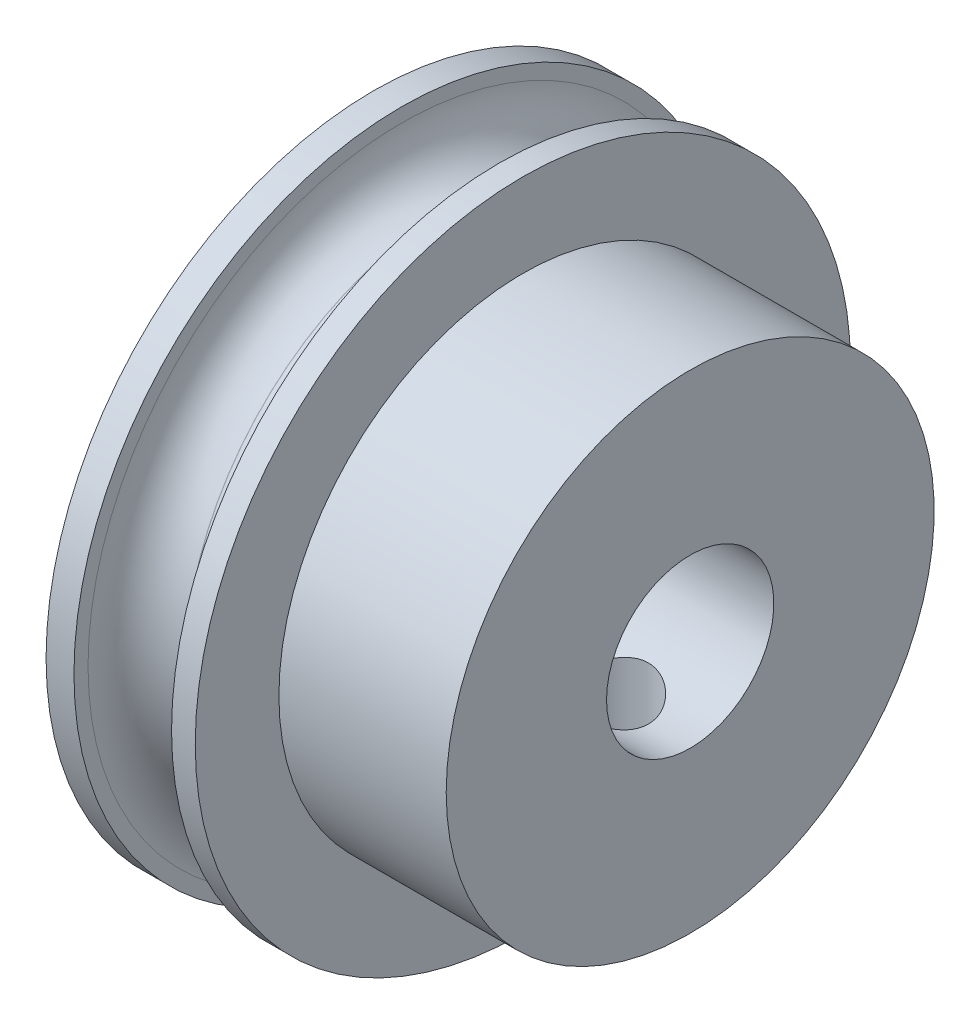
ISO-10303-21;
HEADER;
FILE_DESCRIPTION(('STEP AP214'),'2;1');
FILE_NAME('part.step','',(''),(''),'','','');
FILE_SCHEMA(('AUTOMOTIVE_DESIGN { 1 0 10303 214 1 1 1 1 }'));
ENDSEC;
DATA;
#1=APPLICATION_CONTEXT('core data for automotive mechanical design processes');
#2=APPLICATION_PROTOCOL_DEFINITION('international standard','automotive_design',2000,#1);
#3=PRODUCT_CONTEXT('',#1,'mechanical');
#4=PRODUCT('Part','Part','',(#3));
#5=PRODUCT_RELATED_PRODUCT_CATEGORY('part','',(#4));
#6=PRODUCT_DEFINITION_FORMATION('','',#4);
#7=PRODUCT_DEFINITION_CONTEXT('part definition',#1,'design');
#8=PRODUCT_DEFINITION('design','',#6,#7);
#9=PRODUCT_DEFINITION_SHAPE('','',#8);
#10=(LENGTH_UNIT() NAMED_UNIT(*) SI_UNIT(.MILLI.,.METRE.));
#11=(NAMED_UNIT(*) PLANE_ANGLE_UNIT() SI_UNIT($,.RADIAN.));
#12=(NAMED_UNIT(*) SI_UNIT($,.STERADIAN.) SOLID_ANGLE_UNIT());
#13=UNCERTAINTY_MEASURE_WITH_UNIT(LENGTH_MEASURE(1.E-05),#10,'distance_accuracy_value','');
#14=(GEOMETRIC_REPRESENTATION_CONTEXT(3) GLOBAL_UNCERTAINTY_ASSIGNED_CONTEXT((#13)) GLOBAL_UNIT_ASSIGNED_CONTEXT((#10,
#11,#12)) REPRESENTATION_CONTEXT('',''));
#15=CARTESIAN_POINT('',(0.,0.,0.));
#16=DIRECTION('',(0.,0.,1.));
#17=DIRECTION('',(1.,0.,0.));
#18=AXIS2_PLACEMENT_3D('',#15,#16,#17);
#19=CARTESIAN_POINT('',(0.,23.5,0.));
#20=DIRECTION('',(1.,0.,0.));
#21=DIRECTION('',(0.,0.,-1.));
#22=AXIS2_PLACEMENT_3D('',#19,#20,#21);
#23=PLANE('',#22);
#24=CARTESIAN_POINT('',(0.,0.,0.));
#25=DIRECTION('',(-1.,0.,0.));
#26=DIRECTION('',(0.,0.,1.));
#27=AXIS2_PLACEMENT_3D('',#24,#25,#26);
#28=CIRCLE('',#27,6.);
#29=CARTESIAN_POINT('',(0.,0.,6.00000000000001));
#30=VERTEX_POINT('',#29);
#31=EDGE_CURVE('E86',#30,#30,#28,.T.);
#32=ORIENTED_EDGE('',*,*,#31,.F.);
#33=EDGE_LOOP('',(#32));
#34=FACE_BOUND('',#33,.T.);
#35=CARTESIAN_POINT('',(0.,0.,0.));
#36=DIRECTION('',(-1.,0.,0.));
#37=DIRECTION('',(0.,0.,1.));
#38=AXIS2_PLACEMENT_3D('',#35,#36,#37);
#39=CIRCLE('',#38,23.5);
#40=CARTESIAN_POINT('',(0.,0.,23.5));
#41=VERTEX_POINT('',#40);
#42=EDGE_CURVE('E12',#41,#41,#39,.T.);
#43=ORIENTED_EDGE('',*,*,#42,.T.);
#44=EDGE_LOOP('',(#43));
#45=FACE_BOUND('',#44,.T.);
#46=ADVANCED_FACE('F46',(#34,#45),#23,.F.);
#47=CARTESIAN_POINT('',(0.,0.,0.));
#48=DIRECTION('',(-1.,0.,0.));
#49=DIRECTION('',(0.,0.,1.));
#50=AXIS2_PLACEMENT_3D('',#47,#48,#49);
#51=CYLINDRICAL_SURFACE('',#50,23.5);
#52=ORIENTED_EDGE('',*,*,#42,.F.);
#53=EDGE_LOOP('',(#52));
#54=FACE_BOUND('',#53,.T.);
#55=CARTESIAN_POINT('',(2.,0.,0.));
#56=DIRECTION('',(-1.,0.,0.));
#57=DIRECTION('',(0.,0.,1.));
#58=AXIS2_PLACEMENT_3D('',#55,#56,#57);
#59=CIRCLE('',#58,23.5);
#60=CARTESIAN_POINT('',(2.,0.,23.5));
#61=VERTEX_POINT('',#60);
#62=EDGE_CURVE('E52',#61,#61,#59,.T.);
#63=ORIENTED_EDGE('',*,*,#62,.T.);
#64=EDGE_LOOP('',(#63));
#65=FACE_BOUND('',#64,.T.);
#66=ADVANCED_FACE('F146',(#54,#65),#51,.T.);
#67=CARTESIAN_POINT('',(2.,22.49,0.));
#68=DIRECTION('',(-1.,0.,0.));
#69=DIRECTION('',(0.,0.,1.));
#70=AXIS2_PLACEMENT_3D('',#67,#68,#69);
#71=PLANE('',#70);
#72=ORIENTED_EDGE('',*,*,#62,.F.);
#73=EDGE_LOOP('',(#72));
#74=FACE_BOUND('',#73,.T.);
#75=CARTESIAN_POINT('',(2.,0.,0.));
#76=DIRECTION('',(-1.,0.,0.));
#77=DIRECTION('',(0.,0.,1.));
#78=AXIS2_PLACEMENT_3D('',#75,#76,#77);
#79=CIRCLE('',#78,22.49);
#80=CARTESIAN_POINT('',(2.,0.,22.4900000000001));
#81=VERTEX_POINT('',#80);
#82=EDGE_CURVE('E56',#81,#81,#79,.T.);
#83=ORIENTED_EDGE('',*,*,#82,.T.);
#84=EDGE_LOOP('',(#83));
#85=FACE_BOUND('',#84,.T.);
#86=ADVANCED_FACE('F143',(#74,#85),#71,.F.);
#87=CARTESIAN_POINT('',(5.48999999999999,0.,0.));
#88=DIRECTION('',(-1.,0.,0.));
#89=DIRECTION('',(0.,0.,1.));
#90=AXIS2_PLACEMENT_3D('',#87,#88,#89);
#91=TOROIDAL_SURFACE('',#90,22.49,3.49);
#92=ORIENTED_EDGE('',*,*,#82,.F.);
#93=EDGE_LOOP('',(#92));
#94=FACE_BOUND('',#93,.T.);
#95=CARTESIAN_POINT('',(5.48999999999999,0.,0.));
#96=DIRECTION('',(-1.,0.,0.));
#97=DIRECTION('',(0.,0.,1.));
#98=AXIS2_PLACEMENT_3D('',#95,#96,#97);
#99=CIRCLE('',#98,19.);
#100=CARTESIAN_POINT('',(5.48999999999999,0.,19.));
#101=VERTEX_POINT('',#100);
#102=EDGE_CURVE('E60',#101,#101,#99,.T.);
#103=ORIENTED_EDGE('',*,*,#102,.T.);
#104=EDGE_LOOP('',(#103));
#105=FACE_BOUND('',#104,.T.);
#106=ADVANCED_FACE('F139',(#94,#105),#91,.F.);
#107=CARTESIAN_POINT('',(0.,0.,0.));
#108=DIRECTION('',(-1.,0.,0.));
#109=DIRECTION('',(0.,0.,1.));
#110=AXIS2_PLACEMENT_3D('',#107,#108,#109);
#111=CYLINDRICAL_SURFACE('',#110,19.);
#112=ORIENTED_EDGE('',*,*,#102,.F.);
#113=EDGE_LOOP('',(#112));
#114=FACE_BOUND('',#113,.T.);
#115=CARTESIAN_POINT('',(5.51000000000001,0.,0.));
#116=DIRECTION('',(-1.,0.,0.));
#117=DIRECTION('',(0.,0.,1.));
#118=AXIS2_PLACEMENT_3D('',#115,#116,#117);
#119=CIRCLE('',#118,19.);
#120=CARTESIAN_POINT('',(5.51000000000001,0.,19.));
#121=VERTEX_POINT('',#120);
#122=EDGE_CURVE('E65',#121,#121,#119,.T.);
#123=ORIENTED_EDGE('',*,*,#122,.T.);
#124=EDGE_LOOP('',(#123));
#125=FACE_BOUND('',#124,.T.);
#126=ADVANCED_FACE('F135',(#114,#125),#111,.T.);
#127=CARTESIAN_POINT('',(5.51000000000001,0.,0.));
#128=DIRECTION('',(-1.,0.,0.));
#129=DIRECTION('',(0.,0.,1.));
#130=AXIS2_PLACEMENT_3D('',#127,#128,#129);
#131=TOROIDAL_SURFACE('',#130,22.49,3.49);
#132=ORIENTED_EDGE('',*,*,#122,.F.);
#133=EDGE_LOOP('',(#132));
#134=FACE_BOUND('',#133,.T.);
#135=CARTESIAN_POINT('',(9.00000000000001,0.,0.));
#136=DIRECTION('',(-1.,0.,0.));
#137=DIRECTION('',(0.,0.,1.));
#138=AXIS2_PLACEMENT_3D('',#135,#136,#137);
#139=CIRCLE('',#138,22.49);
#140=CARTESIAN_POINT('',(9.00000000000001,0.,22.4900000000001));
#141=VERTEX_POINT('',#140);
#142=EDGE_CURVE('E68',#141,#141,#139,.T.);
#143=ORIENTED_EDGE('',*,*,#142,.T.);
#144=EDGE_LOOP('',(#143));
#145=FACE_BOUND('',#144,.T.);
#146=ADVANCED_FACE('F131',(#134,#145),#131,.F.);
#147=CARTESIAN_POINT('',(9.00000000000001,23.5,0.));
#148=DIRECTION('',(1.,0.,0.));
#149=DIRECTION('',(0.,0.,-1.));
#150=AXIS2_PLACEMENT_3D('',#147,#148,#149);
#151=PLANE('',#150);
#152=ORIENTED_EDGE('',*,*,#142,.F.);
#153=EDGE_LOOP('',(#152));
#154=FACE_BOUND('',#153,.T.);
#155=CARTESIAN_POINT('',(9.00000000000001,0.,0.));
#156=DIRECTION('',(-1.,0.,0.));
#157=DIRECTION('',(0.,0.,1.));
#158=AXIS2_PLACEMENT_3D('',#155,#156,#157);
#159=CIRCLE('',#158,23.5);
#160=CARTESIAN_POINT('',(9.00000000000001,0.,23.5));
#161=VERTEX_POINT('',#160);
#162=EDGE_CURVE('E71',#161,#161,#159,.T.);
#163=ORIENTED_EDGE('',*,*,#162,.T.);
#164=EDGE_LOOP('',(#163));
#165=FACE_BOUND('',#164,.T.);
#166=ADVANCED_FACE('F127',(#154,#165),#151,.F.);
#167=CARTESIAN_POINT('',(0.,0.,0.));
#168=DIRECTION('',(-1.,0.,0.));
#169=DIRECTION('',(0.,0.,1.));
#170=AXIS2_PLACEMENT_3D('',#167,#168,#169);
#171=CYLINDRICAL_SURFACE('',#170,23.5);
#172=ORIENTED_EDGE('',*,*,#162,.F.);
#173=EDGE_LOOP('',(#172));
#174=FACE_BOUND('',#173,.T.);
#175=CARTESIAN_POINT('',(10.7,0.,0.));
#176=DIRECTION('',(-1.,0.,0.));
#177=DIRECTION('',(0.,0.,1.));
#178=AXIS2_PLACEMENT_3D('',#175,#176,#177);
#179=CIRCLE('',#178,23.5);
#180=CARTESIAN_POINT('',(10.7,0.,23.5));
#181=VERTEX_POINT('',#180);
#182=EDGE_CURVE('E74',#181,#181,#179,.T.);
#183=ORIENTED_EDGE('',*,*,#182,.T.);
#184=EDGE_LOOP('',(#183));
#185=FACE_BOUND('',#184,.T.);
#186=ADVANCED_FACE('F123',(#174,#185),#171,.T.);
#187=CARTESIAN_POINT('',(10.7,17.5,0.));
#188=DIRECTION('',(-1.,0.,0.));
#189=DIRECTION('',(0.,0.,1.));
#190=AXIS2_PLACEMENT_3D('',#187,#188,#189);
#191=PLANE('',#190);
#192=ORIENTED_EDGE('',*,*,#182,.F.);
#193=EDGE_LOOP('',(#192));
#194=FACE_BOUND('',#193,.T.);
#195=CARTESIAN_POINT('',(10.7,0.,0.));
#196=DIRECTION('',(-1.,0.,0.));
#197=DIRECTION('',(0.,0.,1.));
#198=AXIS2_PLACEMENT_3D('',#195,#196,#197);
#199=CIRCLE('',#198,17.5);
#200=CARTESIAN_POINT('',(10.7,0.,17.5));
#201=VERTEX_POINT('',#200);
#202=EDGE_CURVE('E77',#201,#201,#199,.T.);
#203=ORIENTED_EDGE('',*,*,#202,.T.);
#204=EDGE_LOOP('',(#203));
#205=FACE_BOUND('',#204,.T.);
#206=ADVANCED_FACE('F119',(#194,#205),#191,.F.);
#207=CARTESIAN_POINT('',(0.,0.,0.));
#208=DIRECTION('',(-1.,0.,0.));
#209=DIRECTION('',(0.,0.,1.));
#210=AXIS2_PLACEMENT_3D('',#207,#208,#209);
#211=CYLINDRICAL_SURFACE('',#210,17.5);
#212=CARTESIAN_POINT('',(16.6999999999999,-17.2409396495667,3.));
#213=CARTESIAN_POINT('',(16.5328224603279,-17.2409427238107,2.99999334322019));
#214=CARTESIAN_POINT('',(16.3655553898746,-17.2433975799678,2.98597849080082));
#215=CARTESIAN_POINT('',(16.0357195527689,-17.2529421043199,2.93031666162568));
#216=CARTESIAN_POINT('',(15.8731551823205,-17.2600359717149,2.88864464929487));
#217=CARTESIAN_POINT('',(15.5575457035369,-17.2780319968807,2.77897046037274));
#218=CARTESIAN_POINT('',(15.4044925708732,-17.2889308916418,2.71099083852853));
#219=CARTESIAN_POINT('',(15.1119792906479,-17.313305084328,2.55068812102205));
#220=CARTESIAN_POINT('',(14.9725177187283,-17.3267801118422,2.45836757998599));
#221=CARTESIAN_POINT('',(14.7096776955039,-17.3549451758276,2.25097753821766));
#222=CARTESIAN_POINT('',(14.5864614484032,-17.3696453757954,2.1357038162892));
#223=CARTESIAN_POINT('',(14.3610195617949,-17.3985142730381,1.88612097423862));
#224=CARTESIAN_POINT('',(14.2587951947809,-17.4126829380499,1.75181070098526));
#225=CARTESIAN_POINT('',(14.0776271874651,-17.4390002009036,1.46691308220604));
#226=CARTESIAN_POINT('',(13.9988349520455,-17.4511354492007,1.31622811896211));
#227=CARTESIAN_POINT('',(13.8677414975539,-17.4719053147098,1.00351837852193));
#228=CARTESIAN_POINT('',(13.8154384570408,-17.4805401726063,0.841494381888627));
#229=CARTESIAN_POINT('',(13.7393054207373,-17.4932645851017,0.512382868410128));
#230=CARTESIAN_POINT('',(13.7152026712708,-17.4973976536598,0.345360157306981));
#231=CARTESIAN_POINT('',(13.6953058827565,-17.5008024112352,0.00959366953917244));
#232=CARTESIAN_POINT('',(13.6995098130732,-17.500074448968,-0.15914998280326));
#233=CARTESIAN_POINT('',(13.7358951107103,-17.4938735157789,-0.491702223591259));
#234=CARTESIAN_POINT('',(13.7677829099307,-17.4884503360207,-0.655543993481234));
#235=CARTESIAN_POINT('',(13.8581680578799,-17.4735238964266,-0.975516328537322));
#236=CARTESIAN_POINT('',(13.9166662533824,-17.4640205067542,-1.13164664814084));
#237=CARTESIAN_POINT('',(14.0589007507888,-17.4419170029363,-1.43263245757705));
#238=CARTESIAN_POINT('',(14.1427572259216,-17.4293021974191,-1.57743003521032));
#239=CARTESIAN_POINT('',(14.3332397563998,-17.402375995437,-1.85100900942171));
#240=CARTESIAN_POINT('',(14.439867758614,-17.3880644539551,-1.97978903507656));
#241=CARTESIAN_POINT('',(14.6744925512082,-17.3591182543925,-2.21941290689034));
#242=CARTESIAN_POINT('',(14.8027459862427,-17.344481806616,-2.33000539360511));
#243=CARTESIAN_POINT('',(15.0761184279323,-17.3167125731742,-2.5281428324414));
#244=CARTESIAN_POINT('',(15.2212376081395,-17.3035798029848,-2.61568754736629));
#245=CARTESIAN_POINT('',(15.5245227418863,-17.280303555666,-2.76529859974535));
#246=CARTESIAN_POINT('',(15.6827046008145,-17.2701637936693,-2.82733330960207));
#247=CARTESIAN_POINT('',(16.0074567356465,-17.2540820099746,-2.92387975772745));
#248=CARTESIAN_POINT('',(16.1740262257422,-17.2481395958225,-2.95839406920576));
#249=CARTESIAN_POINT('',(16.5085724782545,-17.2412016562193,-2.99856320128751));
#250=CARTESIAN_POINT('',(16.676504908477,-17.2401446099915,-3.00457695031047));
#251=CARTESIAN_POINT('',(17.0109762128296,-17.2429330582015,-2.98853197620302));
#252=CARTESIAN_POINT('',(17.1775151437672,-17.2467783518012,-2.96647440309388));
#253=CARTESIAN_POINT('',(17.5033231897104,-17.258881270067,-2.89521941159184));
#254=CARTESIAN_POINT('',(17.6626337313384,-17.2671089866899,-2.8462058824353));
#255=CARTESIAN_POINT('',(17.9707801836731,-17.2870244527025,-2.72262364312902));
#256=CARTESIAN_POINT('',(18.1196154345992,-17.2987124197933,-2.64805332503165));
#257=CARTESIAN_POINT('',(18.4041803254855,-17.324373772823,-2.474631777694));
#258=CARTESIAN_POINT('',(18.539768284734,-17.3383682986708,-2.37555125161583));
#259=CARTESIAN_POINT('',(18.7925224519554,-17.3670046347296,-2.15623532353631));
#260=CARTESIAN_POINT('',(18.9096872848025,-17.381646493154,-2.03599834380815));
#261=CARTESIAN_POINT('',(19.1235865955531,-17.4101230054923,-1.77618954233155));
#262=CARTESIAN_POINT('',(19.2200812579463,-17.4239469640735,-1.63641893008561));
#263=CARTESIAN_POINT('',(19.3882185513153,-17.4490567338255,-1.34244211015565));
#264=CARTESIAN_POINT('',(19.4598620216096,-17.4603426307116,-1.18823639022305));
#265=CARTESIAN_POINT('',(19.5758931308123,-17.4790582835881,-0.87046817556162));
#266=CARTESIAN_POINT('',(19.6204045659635,-17.4865055299022,-0.706951958816393));
#267=CARTESIAN_POINT('',(19.6813060002942,-17.4967788729714,-0.374626699017889));
#268=CARTESIAN_POINT('',(19.6976984534332,-17.4996053729806,-0.20581811914154));
#269=CARTESIAN_POINT('',(19.7018227351743,-17.5003125469087,0.129988654143578));
#270=CARTESIAN_POINT('',(19.6899188499276,-17.4982560843078,0.296982352593308));
#271=CARTESIAN_POINT('',(19.6385784635561,-17.4895572282875,0.626554113404335));
#272=CARTESIAN_POINT('',(19.59914213888,-17.4829148642581,0.789132204057256));
#273=CARTESIAN_POINT('',(19.4939992002669,-17.4657883771442,1.10510688506268));
#274=CARTESIAN_POINT('',(19.4283252830408,-17.4553090369673,1.25851463077402));
#275=CARTESIAN_POINT('',(19.2726125899402,-17.4316504514312,1.55218949226269));
#276=CARTESIAN_POINT('',(19.1825725517467,-17.4184710662012,1.69245592673014));
#277=CARTESIAN_POINT('',(18.9794002109157,-17.390671178074,1.9576974180599));
#278=CARTESIAN_POINT('',(18.8660018954168,-17.3760351790944,2.08246711008152));
#279=CARTESIAN_POINT('',(18.6198890936351,-17.3470767953719,2.31133475460773));
#280=CARTESIAN_POINT('',(18.4871700882132,-17.3327544849054,2.41542785732053));
#281=CARTESIAN_POINT('',(18.2049934932892,-17.305928230343,2.60071215805765));
#282=CARTESIAN_POINT('',(18.0554173179751,-17.2934388002337,2.68172488708187));
#283=CARTESIAN_POINT('',(17.7446231054956,-17.271864523511,2.81734831227995));
#284=CARTESIAN_POINT('',(17.5834167412173,-17.2627763183618,2.87198506892149));
#285=CARTESIAN_POINT('',(17.301345156446,-17.2510229398289,2.94160477458958));
#286=CARTESIAN_POINT('',(17.182176321494,-17.2472630378549,2.96346733737591));
#287=CARTESIAN_POINT('',(16.9420206094036,-17.2422203045731,2.9926672149412));
#288=CARTESIAN_POINT('',(16.8210337685711,-17.2409374238649,3.00000481939828));
#289=CARTESIAN_POINT('',(16.6999999999999,-17.2409396495667,3.));
#290=B_SPLINE_CURVE_WITH_KNOTS('',3,(#212,#213,#214,#215,#216,#217,#218,#219,#220,#221,#222,
#223,#224,#225,#226,#227,#228,#229,#230,#231,#232,#233,#234,#235,#236,#237,#238,#239,#240,#241,
#242,#243,#244,#245,#246,#247,#248,#249,#250,#251,#252,#253,#254,#255,#256,#257,#258,#259,#260,
#261,#262,#263,#264,#265,#266,#267,#268,#269,#270,#271,#272,#273,#274,#275,#276,#277,#278,#279,
#280,#281,#282,#283,#284,#285,#286,#287,#288,#289),.UNSPECIFIED.,.T.,.F.,(4,2,2,2,2,2,2,2,2,2,2,
2,2,2,2,2,2,2,2,2,2,2,2,2,2,2,2,2,2,2,2,2,2,2,2,2,2,2,4),(0.,0.50108995158825,1.00263411527865,
1.50374923087262,2.00481177439387,2.51054946507378,3.01631780370881,3.52528645944315,
4.03422011289576,4.53818955823087,5.04212285070938,5.54077666683343,6.03944635181162,
6.54051729263447,7.04163109005635,7.54917511935571,8.05672437185112,8.56490100620876,
9.07303011950978,9.57474267565902,10.076434678393,10.5747459232883,11.0730885260168,
11.576282258526,12.0795135322501,12.588300132801,13.0970695480364,13.6034998598,
14.1098859728562,14.6097882655281,15.1096873544766,15.6089654137018,16.1082693436371,
16.6136095803367,17.1190682073767,17.6283353233665,18.1370982288975,18.4998862860552,
18.8626671078861),.UNSPECIFIED.);
#291=CARTESIAN_POINT('',(16.6999999999999,-17.2409396495667,3.));
#292=VERTEX_POINT('',#291);
#293=EDGE_CURVE('E89',#292,#292,#290,.T.);
#294=ORIENTED_EDGE('',*,*,#293,.F.);
#295=EDGE_LOOP('',(#294));
#296=FACE_BOUND('',#295,.T.);
#297=ORIENTED_EDGE('',*,*,#202,.F.);
#298=EDGE_LOOP('',(#297));
#299=FACE_BOUND('',#298,.T.);
#300=CARTESIAN_POINT('',(22.6999999999999,0.,0.));
#301=DIRECTION('',(-1.,0.,0.));
#302=DIRECTION('',(0.,0.,1.));
#303=AXIS2_PLACEMENT_3D('',#300,#301,#302);
#304=CIRCLE('',#303,17.5);
#305=CARTESIAN_POINT('',(22.6999999999999,0.,17.5));
#306=VERTEX_POINT('',#305);
#307=EDGE_CURVE('E80',#306,#306,#304,.T.);
#308=ORIENTED_EDGE('',*,*,#307,.T.);
#309=EDGE_LOOP('',(#308));
#310=FACE_BOUND('',#309,.T.);
#311=ADVANCED_FACE('F115',(#296,#299,#310),#211,.T.);
#312=CARTESIAN_POINT('',(22.6999999999999,6.00000000000003,0.));
#313=DIRECTION('',(-1.,0.,0.));
#314=DIRECTION('',(0.,0.,1.));
#315=AXIS2_PLACEMENT_3D('',#312,#313,#314);
#316=PLANE('',#315);
#317=ORIENTED_EDGE('',*,*,#307,.F.);
#318=EDGE_LOOP('',(#317));
#319=FACE_BOUND('',#318,.T.);
#320=CARTESIAN_POINT('',(22.6999999999999,0.,0.));
#321=DIRECTION('',(-1.,0.,0.));
#322=DIRECTION('',(0.,0.,1.));
#323=AXIS2_PLACEMENT_3D('',#320,#321,#322);
#324=CIRCLE('',#323,6.);
#325=CARTESIAN_POINT('',(22.6999999999999,0.,6.00000000000001));
#326=VERTEX_POINT('',#325);
#327=EDGE_CURVE('E83',#326,#326,#324,.T.);
#328=ORIENTED_EDGE('',*,*,#327,.T.);
#329=EDGE_LOOP('',(#328));
#330=FACE_BOUND('',#329,.T.);
#331=ADVANCED_FACE('F111',(#319,#330),#316,.F.);
#332=CARTESIAN_POINT('',(0.,0.,0.));
#333=DIRECTION('',(-1.,0.,0.));
#334=DIRECTION('',(0.,0.,1.));
#335=AXIS2_PLACEMENT_3D('',#332,#333,#334);
#336=CYLINDRICAL_SURFACE('',#335,6.);
#337=CARTESIAN_POINT('',(16.6999999999999,-5.19615242270663,2.99999999999999));
#338=CARTESIAN_POINT('',(16.778200233259,-5.19615338151414,2.99999910875737));
#339=CARTESIAN_POINT('',(16.8564099984645,-5.19792581191127,2.99693611207794));
#340=CARTESIAN_POINT('',(17.012208075142,-5.20493931657123,2.98473565374508));
#341=CARTESIAN_POINT('',(17.0897960802685,-5.21018200566083,2.97559536411628));
#342=CARTESIAN_POINT('',(17.3209440142464,-5.23088200558206,2.9391691225804));
#343=CARTESIAN_POINT('',(17.4727509105333,-5.25131076607212,2.90287805814904));
#344=CARTESIAN_POINT('',(17.7663916335235,-5.30247746927537,2.80829998089526));
#345=CARTESIAN_POINT('',(17.9082738017509,-5.33316051577918,2.75012989346617));
#346=CARTESIAN_POINT('',(18.1802627617008,-5.40128072966973,2.6138025396466));
#347=CARTESIAN_POINT('',(18.3103689158749,-5.43871826241345,2.53564419197538));
#348=CARTESIAN_POINT('',(18.5669201461477,-5.51990583559836,2.35399963256536));
#349=CARTESIAN_POINT('',(18.6921782021559,-5.56392184571632,2.2489561113736));
#350=CARTESIAN_POINT('',(18.9242243696895,-5.65115954702501,2.01976141989958));
#351=CARTESIAN_POINT('',(19.0310032682567,-5.69438083245619,1.89560077655244));
#352=CARTESIAN_POINT('',(19.2301016877324,-5.77864428988886,1.62146869109161));
#353=CARTESIAN_POINT('',(19.3209613659272,-5.81934318752246,1.4703215671899));
#354=CARTESIAN_POINT('',(19.475422497428,-5.89052268800543,1.15247107964635));
#355=CARTESIAN_POINT('',(19.5390411532466,-5.92100973690812,0.985777614653068));
#356=CARTESIAN_POINT('',(19.6325139979892,-5.96641383603059,0.654134831556275));
#357=CARTESIAN_POINT('',(19.664448579648,-5.98228440595574,0.489905370480152));
#358=CARTESIAN_POINT('',(19.700498355444,-6.00022751605263,0.157711887079217));
#359=CARTESIAN_POINT('',(19.7046303821322,-6.00230840492438,-0.0102498138110452));
#360=CARTESIAN_POINT('',(19.6857599673652,-5.9928894562274,-0.329497576667915));
#361=CARTESIAN_POINT('',(19.6650859119219,-5.98255487247966,-0.480963609704579));
#362=CARTESIAN_POINT('',(19.6013575098035,-5.95122736207789,-0.77794130357984));
#363=CARTESIAN_POINT('',(19.5583014884221,-5.93023363786804,-0.923452517976646));
#364=CARTESIAN_POINT('',(19.4507521442304,-5.87914748253368,-1.20692822064063));
#365=CARTESIAN_POINT('',(19.3859704687993,-5.8489331854518,-1.34476044303));
#366=CARTESIAN_POINT('',(19.237210343292,-5.78212944004645,-1.60793023199367));
#367=CARTESIAN_POINT('',(19.1532250204904,-5.7455377104437,-1.73326330217193));
#368=CARTESIAN_POINT('',(18.9593115260605,-5.66533158492097,-1.98052168794679));
#369=CARTESIAN_POINT('',(18.8476814893583,-5.62138031742824,-2.10100497271933));
#370=CARTESIAN_POINT('',(18.6062402580911,-5.53363118085846,-2.32231036115796));
#371=CARTESIAN_POINT('',(18.4764152061043,-5.48983345502614,-2.42311733790257));
#372=CARTESIAN_POINT('',(18.1920178566592,-5.40432084665526,-2.60852695463449));
#373=CARTESIAN_POINT('',(18.036397564354,-5.36291485750667,-2.69169402852799));
#374=CARTESIAN_POINT('',(17.7924369453882,-5.30915194408667,-2.79542837524197));
#375=CARTESIAN_POINT('',(17.7093436895952,-5.29261946495431,-2.82650797342));
#376=CARTESIAN_POINT('',(17.5401913969656,-5.2629847346327,-2.88131297532032));
#377=CARTESIAN_POINT('',(17.4541342255252,-5.24988036897853,-2.90504291399184));
#378=CARTESIAN_POINT('',(17.286628379776,-5.22855455988392,-2.94323927983803));
#379=CARTESIAN_POINT('',(17.2053505743622,-5.22002982263214,-2.95828810706485));
#380=CARTESIAN_POINT('',(17.0415647613341,-5.20672737157291,-2.98163903200842));
#381=CARTESIAN_POINT('',(16.9590574162517,-5.20194770920409,-2.98994463830254));
#382=CARTESIAN_POINT('',(16.7935289931973,-5.19633662863607,-2.99968663811345));
#383=CARTESIAN_POINT('',(16.7105081180563,-5.19550374026211,-3.00112558946314));
#384=CARTESIAN_POINT('',(16.5447135392354,-5.19780953199966,-2.99712742537403));
#385=CARTESIAN_POINT('',(16.4619398192495,-5.20094794403248,-2.99169077406596));
#386=CARTESIAN_POINT('',(16.2331408639573,-5.21504493010247,-2.96710135231213));
#387=CARTESIAN_POINT('',(16.0880891897367,-5.23019160660497,-2.94056163100183));
#388=CARTESIAN_POINT('',(15.8048690892031,-5.27081666384495,-2.86709067362231));
#389=CARTESIAN_POINT('',(15.6667029081698,-5.29629839028761,-2.82015283383761));
#390=CARTESIAN_POINT('',(15.3937738960801,-5.35608780273027,-2.7049422447844));
#391=CARTESIAN_POINT('',(15.2594650720959,-5.39074960412728,-2.63578205088438));
#392=CARTESIAN_POINT('',(15.0035900616339,-5.46468327792416,-2.47886133231342));
#393=CARTESIAN_POINT('',(14.8820304691885,-5.50395751387986,-2.39109125263821));
#394=CARTESIAN_POINT('',(14.6390643733681,-5.58864005140302,-2.18651145695799));
#395=CARTESIAN_POINT('',(14.5196087290999,-5.63419752084737,-2.06743580499401));
#396=CARTESIAN_POINT('',(14.3017631047051,-5.72202702310923,-1.81021349814981));
#397=CARTESIAN_POINT('',(14.2033802403245,-5.76429794308226,-1.67206042712515));
#398=CARTESIAN_POINT('',(14.0282788724263,-5.84224085806644,-1.3756060844338));
#399=CARTESIAN_POINT('',(13.9522006581168,-5.87770925226883,-1.21686929217558));
#400=CARTESIAN_POINT('',(13.8285862756894,-5.93650064667292,-0.886567094469574));
#401=CARTESIAN_POINT('',(13.7810250451581,-5.95983430919529,-0.71501310312401));
#402=CARTESIAN_POINT('',(13.7198943081509,-5.99002524645178,-0.380939047947188));
#403=CARTESIAN_POINT('',(13.7036063644392,-5.99819783930701,-0.219034335650389));
#404=CARTESIAN_POINT('',(13.6974702115664,-6.00126390919338,0.10537796195119));
#405=CARTESIAN_POINT('',(13.7076127468168,-5.99616203476053,0.267885316317448));
#406=CARTESIAN_POINT('',(13.7522491901335,-5.97401907190635,0.577613962536142));
#407=CARTESIAN_POINT('',(13.7850944376656,-5.95778686442443,0.725136901247742));
#408=CARTESIAN_POINT('',(13.871981108032,-5.91576278551446,1.01233790874443));
#409=CARTESIAN_POINT('',(13.9260255705425,-5.88996954319456,1.15201484923629));
#410=CARTESIAN_POINT('',(14.0561807286888,-5.82977801711599,1.42627001605164));
#411=CARTESIAN_POINT('',(14.1331363415363,-5.79505887623286,1.56037465678414));
#412=CARTESIAN_POINT('',(14.3058754214135,-5.72064363382009,1.81432469711305));
#413=CARTESIAN_POINT('',(14.4016675359887,-5.68094524943991,1.93416350676912));
#414=CARTESIAN_POINT('',(14.6203847224835,-5.59585978819441,2.1687388408778));
#415=CARTESIAN_POINT('',(14.7450613207736,-5.5502997550452,2.28178066887875));
#416=CARTESIAN_POINT('',(15.0123783280701,-5.46188649509674,2.48600225783031));
#417=CARTESIAN_POINT('',(15.155034461031,-5.41903568750864,2.57716267726709));
#418=CARTESIAN_POINT('',(15.3825317933017,-5.36004774906984,2.69665559342492));
#419=CARTESIAN_POINT('',(15.4619758009824,-5.34101219148462,2.73405408762356));
#420=CARTESIAN_POINT('',(15.6243532830087,-5.30572783063718,2.80191257626506));
#421=CARTESIAN_POINT('',(15.707284933748,-5.28947759301443,2.83237614466585));
#422=CARTESIAN_POINT('',(15.8758447323697,-5.26045215868185,2.88592624586959));
#423=CARTESIAN_POINT('',(15.9614653072413,-5.24766803509091,2.90903175649394));
#424=CARTESIAN_POINT('',(16.1348552553142,-5.22608869625112,2.94762428051631));
#425=CARTESIAN_POINT('',(16.2226230809206,-5.21729069243664,2.96311662049623));
#426=CARTESIAN_POINT('',(16.3753988177599,-5.20588528016132,2.98309381225722));
#427=CARTESIAN_POINT('',(16.4400948089069,-5.20224442588138,2.98942746228381));
#428=CARTESIAN_POINT('',(16.5698583167996,-5.19737751744686,2.99788106792141));
#429=CARTESIAN_POINT('',(16.6349258581076,-5.1961516248372,3.00000074164546));
#430=CARTESIAN_POINT('',(16.6999999999999,-5.19615242270663,2.99999999999999));
#431=B_SPLINE_CURVE_WITH_KNOTS('',3,(#337,#338,#339,#340,#341,#342,#343,#344,#345,#346,#347,
#348,#349,#350,#351,#352,#353,#354,#355,#356,#357,#358,#359,#360,#361,#362,#363,#364,#365,#366,
#367,#368,#369,#370,#371,#372,#373,#374,#375,#376,#377,#378,#379,#380,#381,#382,#383,#384,#385,
#386,#387,#388,#389,#390,#391,#392,#393,#394,#395,#396,#397,#398,#399,#400,#401,#402,#403,#404,
#405,#406,#407,#408,#409,#410,#411,#412,#413,#414,#415,#416,#417,#418,#419,#420,#421,#422,#423,
#424,#425,#426,#427,#428,#429,#430),.UNSPECIFIED.,.T.,.F.,(4,2,2,2,2,2,2,2,2,2,2,2,2,2,2,2,2,2,
2,2,2,2,2,2,2,2,2,2,2,2,2,2,2,2,2,2,2,2,2,2,2,2,2,2,2,2,4),(0.,0.234529430733907,
0.469168072604295,0.938850383294577,1.40605749261245,1.8732898812166,2.37905864237588,
2.88507883741234,3.42520847204409,3.96499651379791,4.46637625391922,4.96745241546235,
5.4249546294173,5.88249108040481,6.34635774681555,6.8103906853893,7.31828744858787,
7.82657315225873,8.3671369567646,8.63752916119814,8.90775419202326,9.15669600787591,
9.40550821320572,9.65422772860783,9.90293045534217,10.3454331624117,10.7880792327729,
11.2512265518736,11.7146122462925,12.2364099671094,12.7583836090371,13.29413310208,
13.8294110539542,14.3155757713756,14.8015702635102,15.2555404058358,15.7095756650515,
16.1830301812752,16.6567025627126,17.1775149151931,17.6987859450457,17.968011589323,
18.2370981707631,18.5054849980179,18.7736837791729,18.9688338446807,19.1639969639895),.UNSPECIFIED.);
#432=CARTESIAN_POINT('',(16.6999999999999,-5.19615242270663,2.99999999999999));
#433=VERTEX_POINT('',#432);
#434=EDGE_CURVE('E96',#433,#433,#431,.T.);
#435=ORIENTED_EDGE('',*,*,#434,.F.);
#436=EDGE_LOOP('',(#435));
#437=FACE_BOUND('',#436,.T.);
#438=ORIENTED_EDGE('',*,*,#327,.F.);
#439=EDGE_LOOP('',(#438));
#440=FACE_BOUND('',#439,.T.);
#441=ORIENTED_EDGE('',*,*,#31,.T.);
#442=EDGE_LOOP('',(#441));
#443=FACE_BOUND('',#442,.T.);
#444=ADVANCED_FACE('F106',(#437,#440,#443),#336,.F.);
#445=CARTESIAN_POINT('',(16.6999999999999,-23.501,0.));
#446=DIRECTION('',(0.,0.999999999999999,0.));
#447=DIRECTION('',(0.,0.,1.));
#448=AXIS2_PLACEMENT_3D('',#445,#446,#447);
#449=CYLINDRICAL_SURFACE('',#448,3.);
#450=ORIENTED_EDGE('',*,*,#434,.T.);
#451=EDGE_LOOP('',(#450));
#452=FACE_BOUND('',#451,.T.);
#453=ORIENTED_EDGE('',*,*,#293,.T.);
#454=EDGE_LOOP('',(#453));
#455=FACE_BOUND('',#454,.T.);
#456=ADVANCED_FACE('F100',(#452,#455),#449,.F.);
#457=CLOSED_SHELL('',(#46,#66,#86,#106,#126,#146,#166,#186,#206,#311,#331,#444,#456));
#458=MANIFOLD_SOLID_BREP('B2',#457);
#459=ADVANCED_BREP_SHAPE_REPRESENTATION('',(#18,#458),#14);
#460=SHAPE_DEFINITION_REPRESENTATION(#9,#459);
ENDSEC;
END-ISO-10303-21;
